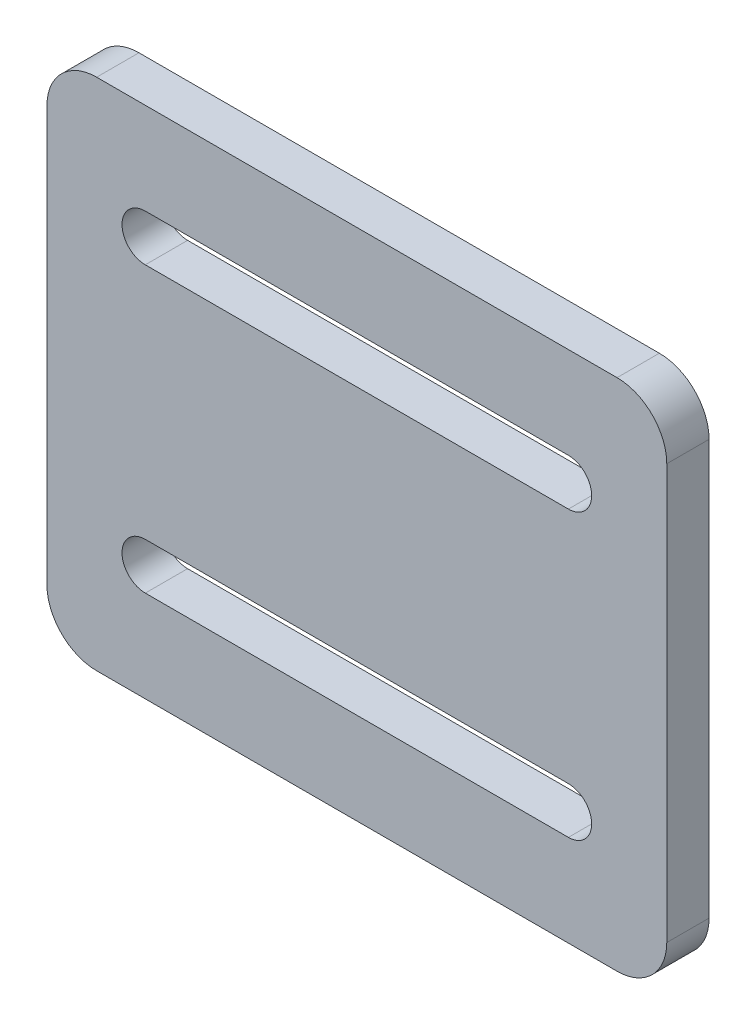
ISO-10303-21;
HEADER;
FILE_DESCRIPTION(('STEP AP214'),'2;1');
FILE_NAME('part.step','',(''),(''),'','','');
FILE_SCHEMA(('AUTOMOTIVE_DESIGN { 1 0 10303 214 1 1 1 1 }'));
ENDSEC;
DATA;
#1=APPLICATION_CONTEXT('core data for automotive mechanical design processes');
#2=APPLICATION_PROTOCOL_DEFINITION('international standard','automotive_design',2000,#1);
#3=PRODUCT_CONTEXT('',#1,'mechanical');
#4=PRODUCT('Part','Part','',(#3));
#5=PRODUCT_RELATED_PRODUCT_CATEGORY('part','',(#4));
#6=PRODUCT_DEFINITION_FORMATION('','',#4);
#7=PRODUCT_DEFINITION_CONTEXT('part definition',#1,'design');
#8=PRODUCT_DEFINITION('design','',#6,#7);
#9=PRODUCT_DEFINITION_SHAPE('','',#8);
#10=(LENGTH_UNIT() NAMED_UNIT(*) SI_UNIT(.MILLI.,.METRE.));
#11=(NAMED_UNIT(*) PLANE_ANGLE_UNIT() SI_UNIT($,.RADIAN.));
#12=(NAMED_UNIT(*) SI_UNIT($,.STERADIAN.) SOLID_ANGLE_UNIT());
#13=UNCERTAINTY_MEASURE_WITH_UNIT(LENGTH_MEASURE(1.E-05),#10,'distance_accuracy_value','');
#14=(GEOMETRIC_REPRESENTATION_CONTEXT(3) GLOBAL_UNCERTAINTY_ASSIGNED_CONTEXT((#13)) GLOBAL_UNIT_ASSIGNED_CONTEXT((#10,
#11,#12)) REPRESENTATION_CONTEXT('',''));
#15=CARTESIAN_POINT('',(0.,0.,0.));
#16=DIRECTION('',(0.,0.,1.));
#17=DIRECTION('',(1.,0.,0.));
#18=AXIS2_PLACEMENT_3D('',#15,#16,#17);
#19=CARTESIAN_POINT('',(-36.854396855232,20.8824296097592,2.));
#20=DIRECTION('',(0.,0.,1.));
#21=DIRECTION('',(1.,0.,0.));
#22=AXIS2_PLACEMENT_3D('',#19,#20,#21);
#23=PLANE('',#22);
#24=DIRECTION('',(1.,0.,0.));
#25=VECTOR('',#24,1.);
#26=CARTESIAN_POINT('',(-34.554396855232,16.7024296097592,2.));
#27=LINE('',#26,#25);
#28=CARTESIAN_POINT('',(-34.554396855232,16.7024296097592,2.));
#29=VERTEX_POINT('',#28);
#30=CARTESIAN_POINT('',(-14.554396855232,16.7024296097592,2.));
#31=VERTEX_POINT('',#30);
#32=EDGE_CURVE('E216',#29,#31,#27,.T.);
#33=ORIENTED_EDGE('',*,*,#32,.F.);
#34=CARTESIAN_POINT('',(-34.554396855232,17.8024296097592,2.));
#35=DIRECTION('',(0.,0.,1.));
#36=DIRECTION('',(1.,0.,0.));
#37=AXIS2_PLACEMENT_3D('',#34,#35,#36);
#38=CIRCLE('',#37,1.1);
#39=CARTESIAN_POINT('',(-34.5543968552321,18.9024296097592,2.));
#40=VERTEX_POINT('',#39);
#41=EDGE_CURVE('E214',#40,#29,#38,.T.);
#42=ORIENTED_EDGE('',*,*,#41,.F.);
#43=DIRECTION('',(-1.,0.,0.));
#44=VECTOR('',#43,1.);
#45=CARTESIAN_POINT('',(-14.554396855232,18.9024296097592,2.));
#46=LINE('',#45,#44);
#47=CARTESIAN_POINT('',(-14.554396855232,18.9024296097592,2.));
#48=VERTEX_POINT('',#47);
#49=EDGE_CURVE('E222',#48,#40,#46,.T.);
#50=ORIENTED_EDGE('',*,*,#49,.F.);
#51=CARTESIAN_POINT('',(-14.554396855232,17.8024296097592,2.));
#52=DIRECTION('',(0.,0.,1.));
#53=DIRECTION('',(1.,0.,0.));
#54=AXIS2_PLACEMENT_3D('',#51,#52,#53);
#55=CIRCLE('',#54,1.1);
#56=EDGE_CURVE('E219',#31,#48,#55,.T.);
#57=ORIENTED_EDGE('',*,*,#56,.F.);
#58=EDGE_LOOP('',(#33,#42,#50,#57));
#59=FACE_BOUND('',#58,.T.);
#60=DIRECTION('',(1.,0.,0.));
#61=VECTOR('',#60,1.);
#62=CARTESIAN_POINT('',(-34.554396855232,3.26242960975919,2.));
#63=LINE('',#62,#61);
#64=CARTESIAN_POINT('',(-34.554396855232,3.26242960975919,2.));
#65=VERTEX_POINT('',#64);
#66=CARTESIAN_POINT('',(-14.554396855232,3.26242960975919,2.));
#67=VERTEX_POINT('',#66);
#68=EDGE_CURVE('E247',#65,#67,#63,.T.);
#69=ORIENTED_EDGE('',*,*,#68,.F.);
#70=CARTESIAN_POINT('',(-34.554396855232,4.36242960975919,2.));
#71=DIRECTION('',(0.,0.,1.));
#72=DIRECTION('',(1.,0.,0.));
#73=AXIS2_PLACEMENT_3D('',#70,#71,#72);
#74=CIRCLE('',#73,1.1);
#75=CARTESIAN_POINT('',(-34.554396855232,5.46242960975919,2.));
#76=VERTEX_POINT('',#75);
#77=EDGE_CURVE('E245',#76,#65,#74,.T.);
#78=ORIENTED_EDGE('',*,*,#77,.F.);
#79=DIRECTION('',(-1.,0.,0.));
#80=VECTOR('',#79,1.);
#81=CARTESIAN_POINT('',(-14.554396855232,5.46242960975919,2.));
#82=LINE('',#81,#80);
#83=CARTESIAN_POINT('',(-14.554396855232,5.46242960975919,2.));
#84=VERTEX_POINT('',#83);
#85=EDGE_CURVE('E253',#84,#76,#82,.T.);
#86=ORIENTED_EDGE('',*,*,#85,.F.);
#87=CARTESIAN_POINT('',(-14.554396855232,4.36242960975919,2.));
#88=DIRECTION('',(0.,0.,1.));
#89=DIRECTION('',(1.,0.,0.));
#90=AXIS2_PLACEMENT_3D('',#87,#88,#89);
#91=CIRCLE('',#90,1.1);
#92=EDGE_CURVE('E250',#67,#84,#91,.T.);
#93=ORIENTED_EDGE('',*,*,#92,.F.);
#94=EDGE_LOOP('',(#69,#78,#86,#93));
#95=FACE_BOUND('',#94,.T.);
#96=DIRECTION('',(-1.,0.,0.));
#97=VECTOR('',#96,1.);
#98=CARTESIAN_POINT('',(-12.254396855232,23.2324296097592,2.));
#99=LINE('',#98,#97);
#100=CARTESIAN_POINT('',(-12.254396855232,23.2324296097592,2.));
#101=VERTEX_POINT('',#100);
#102=CARTESIAN_POINT('',(-36.854396855232,23.2324296097592,2.));
#103=VERTEX_POINT('',#102);
#104=EDGE_CURVE('E199',#101,#103,#99,.T.);
#105=ORIENTED_EDGE('',*,*,#104,.T.);
#106=CARTESIAN_POINT('',(-36.854396855232,20.8824296097592,2.));
#107=DIRECTION('',(0.,0.,1.));
#108=DIRECTION('',(1.,0.,0.));
#109=AXIS2_PLACEMENT_3D('',#106,#107,#108);
#110=CIRCLE('',#109,2.35);
#111=CARTESIAN_POINT('',(-39.204396855232,20.8824296097592,2.));
#112=VERTEX_POINT('',#111);
#113=EDGE_CURVE('E182',#103,#112,#110,.T.);
#114=ORIENTED_EDGE('',*,*,#113,.T.);
#115=DIRECTION('',(0.,-1.,0.));
#116=VECTOR('',#115,1.);
#117=CARTESIAN_POINT('',(-39.204396855232,20.8824296097592,2.));
#118=LINE('',#117,#116);
#119=CARTESIAN_POINT('',(-39.204396855232,1.28242960975919,2.));
#120=VERTEX_POINT('',#119);
#121=EDGE_CURVE('E185',#112,#120,#118,.T.);
#122=ORIENTED_EDGE('',*,*,#121,.T.);
#123=CARTESIAN_POINT('',(-36.854396855232,1.28242960975919,2.));
#124=DIRECTION('',(0.,0.,1.));
#125=DIRECTION('',(1.,0.,0.));
#126=AXIS2_PLACEMENT_3D('',#123,#124,#125);
#127=CIRCLE('',#126,2.35000000000001);
#128=CARTESIAN_POINT('',(-36.854396855232,-1.06757039024081,2.));
#129=VERTEX_POINT('',#128);
#130=EDGE_CURVE('E48',#120,#129,#127,.T.);
#131=ORIENTED_EDGE('',*,*,#130,.T.);
#132=DIRECTION('',(1.,0.,0.));
#133=VECTOR('',#132,1.);
#134=CARTESIAN_POINT('',(-36.854396855232,-1.06757039024081,2.));
#135=LINE('',#134,#133);
#136=CARTESIAN_POINT('',(-12.254396855232,-1.06757039024081,2.));
#137=VERTEX_POINT('',#136);
#138=EDGE_CURVE('E153',#129,#137,#135,.T.);
#139=ORIENTED_EDGE('',*,*,#138,.T.);
#140=CARTESIAN_POINT('',(-12.254396855232,1.28242960975919,2.));
#141=DIRECTION('',(0.,0.,1.));
#142=DIRECTION('',(1.,0.,0.));
#143=AXIS2_PLACEMENT_3D('',#140,#141,#142);
#144=CIRCLE('',#143,2.35);
#145=CARTESIAN_POINT('',(-9.90439685523203,1.28242960975919,2.));
#146=VERTEX_POINT('',#145);
#147=EDGE_CURVE('E190',#137,#146,#144,.T.);
#148=ORIENTED_EDGE('',*,*,#147,.T.);
#149=DIRECTION('',(0.,1.,0.));
#150=VECTOR('',#149,1.);
#151=CARTESIAN_POINT('',(-9.90439685523203,1.28242960975919,2.));
#152=LINE('',#151,#150);
#153=CARTESIAN_POINT('',(-9.90439685523203,20.8824296097592,2.));
#154=VERTEX_POINT('',#153);
#155=EDGE_CURVE('E193',#146,#154,#152,.T.);
#156=ORIENTED_EDGE('',*,*,#155,.T.);
#157=CARTESIAN_POINT('',(-12.254396855232,20.8824296097592,2.));
#158=DIRECTION('',(0.,0.,1.));
#159=DIRECTION('',(1.,0.,0.));
#160=AXIS2_PLACEMENT_3D('',#157,#158,#159);
#161=CIRCLE('',#160,2.35);
#162=EDGE_CURVE('E196',#154,#101,#161,.T.);
#163=ORIENTED_EDGE('',*,*,#162,.T.);
#164=EDGE_LOOP('',(#105,#114,#122,#131,#139,#148,#156,#163));
#165=FACE_BOUND('',#164,.T.);
#166=ADVANCED_FACE('F33',(#59,#95,#165),#23,.T.);
#167=CARTESIAN_POINT('',(-36.854396855232,20.8824296097592,0.));
#168=DIRECTION('',(0.,0.,1.));
#169=DIRECTION('',(1.,0.,0.));
#170=AXIS2_PLACEMENT_3D('',#167,#168,#169);
#171=PLANE('',#170);
#172=CARTESIAN_POINT('',(-34.554396855232,17.8024296097592,0.));
#173=DIRECTION('',(0.,0.,1.));
#174=DIRECTION('',(1.,0.,0.));
#175=AXIS2_PLACEMENT_3D('',#172,#173,#174);
#176=CIRCLE('',#175,1.1);
#177=CARTESIAN_POINT('',(-34.5543968552321,18.9024296097592,0.));
#178=VERTEX_POINT('',#177);
#179=CARTESIAN_POINT('',(-34.554396855232,16.7024296097592,0.));
#180=VERTEX_POINT('',#179);
#181=EDGE_CURVE('E204',#178,#180,#176,.T.);
#182=ORIENTED_EDGE('',*,*,#181,.T.);
#183=DIRECTION('',(1.,0.,0.));
#184=VECTOR('',#183,1.);
#185=CARTESIAN_POINT('',(-34.554396855232,16.7024296097592,0.));
#186=LINE('',#185,#184);
#187=CARTESIAN_POINT('',(-14.554396855232,16.7024296097592,0.));
#188=VERTEX_POINT('',#187);
#189=EDGE_CURVE('E227',#180,#188,#186,.T.);
#190=ORIENTED_EDGE('',*,*,#189,.T.);
#191=CARTESIAN_POINT('',(-14.554396855232,17.8024296097592,0.));
#192=DIRECTION('',(0.,0.,1.));
#193=DIRECTION('',(1.,0.,0.));
#194=AXIS2_PLACEMENT_3D('',#191,#192,#193);
#195=CIRCLE('',#194,1.1);
#196=CARTESIAN_POINT('',(-14.554396855232,18.9024296097592,0.));
#197=VERTEX_POINT('',#196);
#198=EDGE_CURVE('E230',#188,#197,#195,.T.);
#199=ORIENTED_EDGE('',*,*,#198,.T.);
#200=DIRECTION('',(-1.,0.,0.));
#201=VECTOR('',#200,1.);
#202=CARTESIAN_POINT('',(-14.554396855232,18.9024296097592,0.));
#203=LINE('',#202,#201);
#204=EDGE_CURVE('E217',#197,#178,#203,.T.);
#205=ORIENTED_EDGE('',*,*,#204,.T.);
#206=EDGE_LOOP('',(#182,#190,#199,#205));
#207=FACE_BOUND('',#206,.T.);
#208=CARTESIAN_POINT('',(-34.554396855232,4.36242960975919,0.));
#209=DIRECTION('',(0.,0.,1.));
#210=DIRECTION('',(1.,0.,0.));
#211=AXIS2_PLACEMENT_3D('',#208,#209,#210);
#212=CIRCLE('',#211,1.1);
#213=CARTESIAN_POINT('',(-34.554396855232,5.46242960975919,0.));
#214=VERTEX_POINT('',#213);
#215=CARTESIAN_POINT('',(-34.554396855232,3.26242960975919,0.));
#216=VERTEX_POINT('',#215);
#217=EDGE_CURVE('E244',#214,#216,#212,.T.);
#218=ORIENTED_EDGE('',*,*,#217,.T.);
#219=DIRECTION('',(1.,0.,0.));
#220=VECTOR('',#219,1.);
#221=CARTESIAN_POINT('',(-34.554396855232,3.26242960975919,0.));
#222=LINE('',#221,#220);
#223=CARTESIAN_POINT('',(-14.554396855232,3.26242960975919,0.));
#224=VERTEX_POINT('',#223);
#225=EDGE_CURVE('E258',#216,#224,#222,.T.);
#226=ORIENTED_EDGE('',*,*,#225,.T.);
#227=CARTESIAN_POINT('',(-14.554396855232,4.36242960975919,0.));
#228=DIRECTION('',(0.,0.,1.));
#229=DIRECTION('',(1.,0.,0.));
#230=AXIS2_PLACEMENT_3D('',#227,#228,#229);
#231=CIRCLE('',#230,1.1);
#232=CARTESIAN_POINT('',(-14.554396855232,5.46242960975919,0.));
#233=VERTEX_POINT('',#232);
#234=EDGE_CURVE('E261',#224,#233,#231,.T.);
#235=ORIENTED_EDGE('',*,*,#234,.T.);
#236=DIRECTION('',(-1.,0.,0.));
#237=VECTOR('',#236,1.);
#238=CARTESIAN_POINT('',(-14.554396855232,5.46242960975919,0.));
#239=LINE('',#238,#237);
#240=EDGE_CURVE('E248',#233,#214,#239,.T.);
#241=ORIENTED_EDGE('',*,*,#240,.T.);
#242=EDGE_LOOP('',(#218,#226,#235,#241));
#243=FACE_BOUND('',#242,.T.);
#244=CARTESIAN_POINT('',(-36.854396855232,20.8824296097592,0.));
#245=DIRECTION('',(0.,0.,1.));
#246=DIRECTION('',(1.,0.,0.));
#247=AXIS2_PLACEMENT_3D('',#244,#245,#246);
#248=CIRCLE('',#247,2.35);
#249=CARTESIAN_POINT('',(-36.854396855232,23.2324296097592,0.));
#250=VERTEX_POINT('',#249);
#251=CARTESIAN_POINT('',(-39.204396855232,20.8824296097592,0.));
#252=VERTEX_POINT('',#251);
#253=EDGE_CURVE('E56',#250,#252,#248,.T.);
#254=ORIENTED_EDGE('',*,*,#253,.F.);
#255=DIRECTION('',(-1.,0.,0.));
#256=VECTOR('',#255,1.);
#257=CARTESIAN_POINT('',(-12.254396855232,23.2324296097592,0.));
#258=LINE('',#257,#256);
#259=CARTESIAN_POINT('',(-12.254396855232,23.2324296097592,0.));
#260=VERTEX_POINT('',#259);
#261=EDGE_CURVE('E178',#260,#250,#258,.T.);
#262=ORIENTED_EDGE('',*,*,#261,.F.);
#263=CARTESIAN_POINT('',(-12.254396855232,20.8824296097592,0.));
#264=DIRECTION('',(0.,0.,1.));
#265=DIRECTION('',(1.,0.,0.));
#266=AXIS2_PLACEMENT_3D('',#263,#264,#265);
#267=CIRCLE('',#266,2.35);
#268=CARTESIAN_POINT('',(-9.90439685523203,20.8824296097592,0.));
#269=VERTEX_POINT('',#268);
#270=EDGE_CURVE('E175',#269,#260,#267,.T.);
#271=ORIENTED_EDGE('',*,*,#270,.F.);
#272=DIRECTION('',(0.,1.,0.));
#273=VECTOR('',#272,1.);
#274=CARTESIAN_POINT('',(-9.90439685523203,1.28242960975919,0.));
#275=LINE('',#274,#273);
#276=CARTESIAN_POINT('',(-9.90439685523203,1.28242960975919,0.));
#277=VERTEX_POINT('',#276);
#278=EDGE_CURVE('E169',#277,#269,#275,.T.);
#279=ORIENTED_EDGE('',*,*,#278,.F.);
#280=CARTESIAN_POINT('',(-12.254396855232,1.28242960975919,0.));
#281=DIRECTION('',(0.,0.,1.));
#282=DIRECTION('',(1.,0.,0.));
#283=AXIS2_PLACEMENT_3D('',#280,#281,#282);
#284=CIRCLE('',#283,2.35);
#285=CARTESIAN_POINT('',(-12.254396855232,-1.06757039024081,0.));
#286=VERTEX_POINT('',#285);
#287=EDGE_CURVE('E167',#286,#277,#284,.T.);
#288=ORIENTED_EDGE('',*,*,#287,.F.);
#289=DIRECTION('',(1.,0.,0.));
#290=VECTOR('',#289,1.);
#291=CARTESIAN_POINT('',(-36.854396855232,-1.06757039024081,0.));
#292=LINE('',#291,#290);
#293=CARTESIAN_POINT('',(-36.854396855232,-1.06757039024081,0.));
#294=VERTEX_POINT('',#293);
#295=EDGE_CURVE('E150',#294,#286,#292,.T.);
#296=ORIENTED_EDGE('',*,*,#295,.F.);
#297=CARTESIAN_POINT('',(-36.854396855232,1.28242960975919,0.));
#298=DIRECTION('',(0.,0.,1.));
#299=DIRECTION('',(1.,0.,0.));
#300=AXIS2_PLACEMENT_3D('',#297,#298,#299);
#301=CIRCLE('',#300,2.35000000000001);
#302=CARTESIAN_POINT('',(-39.204396855232,1.28242960975919,0.));
#303=VERTEX_POINT('',#302);
#304=EDGE_CURVE('E158',#303,#294,#301,.T.);
#305=ORIENTED_EDGE('',*,*,#304,.F.);
#306=DIRECTION('',(0.,-1.,0.));
#307=VECTOR('',#306,1.);
#308=CARTESIAN_POINT('',(-39.204396855232,20.8824296097592,0.));
#309=LINE('',#308,#307);
#310=EDGE_CURVE('E163',#252,#303,#309,.T.);
#311=ORIENTED_EDGE('',*,*,#310,.F.);
#312=EDGE_LOOP('',(#254,#262,#271,#279,#288,#296,#305,#311));
#313=FACE_BOUND('',#312,.T.);
#314=ADVANCED_FACE('F35',(#207,#243,#313),#171,.F.);
#315=CARTESIAN_POINT('',(-34.554396855232,4.36242960975919,2.));
#316=DIRECTION('',(0.,0.,-1.));
#317=DIRECTION('',(-1.,0.,0.));
#318=AXIS2_PLACEMENT_3D('',#315,#316,#317);
#319=CYLINDRICAL_SURFACE('',#318,1.1);
#320=ORIENTED_EDGE('',*,*,#217,.F.);
#321=DIRECTION('',(0.,0.,-1.));
#322=VECTOR('',#321,1.);
#323=CARTESIAN_POINT('',(-34.554396855232,5.46242960975919,2.));
#324=LINE('',#323,#322);
#325=EDGE_CURVE('E255',#76,#214,#324,.T.);
#326=ORIENTED_EDGE('',*,*,#325,.F.);
#327=ORIENTED_EDGE('',*,*,#77,.T.);
#328=DIRECTION('',(0.,0.,-1.));
#329=VECTOR('',#328,1.);
#330=CARTESIAN_POINT('',(-34.554396855232,3.26242960975919,2.));
#331=LINE('',#330,#329);
#332=EDGE_CURVE('E11',#65,#216,#331,.T.);
#333=ORIENTED_EDGE('',*,*,#332,.T.);
#334=EDGE_LOOP('',(#320,#326,#327,#333));
#335=FACE_BOUND('',#334,.T.);
#336=ADVANCED_FACE('F282',(#335),#319,.F.);
#337=CARTESIAN_POINT('',(-34.554396855232,3.26242960975919,2.));
#338=DIRECTION('',(0.,1.,0.));
#339=DIRECTION('',(-1.,0.,0.));
#340=AXIS2_PLACEMENT_3D('',#337,#338,#339);
#341=PLANE('',#340);
#342=ORIENTED_EDGE('',*,*,#225,.F.);
#343=ORIENTED_EDGE('',*,*,#332,.F.);
#344=ORIENTED_EDGE('',*,*,#68,.T.);
#345=DIRECTION('',(0.,0.,-1.));
#346=VECTOR('',#345,1.);
#347=CARTESIAN_POINT('',(-14.554396855232,3.26242960975919,2.));
#348=LINE('',#347,#346);
#349=EDGE_CURVE('E41',#67,#224,#348,.T.);
#350=ORIENTED_EDGE('',*,*,#349,.T.);
#351=EDGE_LOOP('',(#342,#343,#344,#350));
#352=FACE_BOUND('',#351,.T.);
#353=ADVANCED_FACE('F272',(#352),#341,.T.);
#354=CARTESIAN_POINT('',(-14.554396855232,4.36242960975919,2.));
#355=DIRECTION('',(0.,0.,-1.));
#356=DIRECTION('',(-1.,0.,0.));
#357=AXIS2_PLACEMENT_3D('',#354,#355,#356);
#358=CYLINDRICAL_SURFACE('',#357,1.1);
#359=ORIENTED_EDGE('',*,*,#234,.F.);
#360=ORIENTED_EDGE('',*,*,#349,.F.);
#361=ORIENTED_EDGE('',*,*,#92,.T.);
#362=DIRECTION('',(0.,0.,-1.));
#363=VECTOR('',#362,1.);
#364=CARTESIAN_POINT('',(-14.554396855232,5.46242960975919,2.));
#365=LINE('',#364,#363);
#366=EDGE_CURVE('E268',#84,#233,#365,.T.);
#367=ORIENTED_EDGE('',*,*,#366,.T.);
#368=EDGE_LOOP('',(#359,#360,#361,#367));
#369=FACE_BOUND('',#368,.T.);
#370=ADVANCED_FACE('F277',(#369),#358,.F.);
#371=CARTESIAN_POINT('',(-14.554396855232,5.46242960975919,2.));
#372=DIRECTION('',(0.,-1.,0.));
#373=DIRECTION('',(1.,0.,0.));
#374=AXIS2_PLACEMENT_3D('',#371,#372,#373);
#375=PLANE('',#374);
#376=ORIENTED_EDGE('',*,*,#240,.F.);
#377=ORIENTED_EDGE('',*,*,#366,.F.);
#378=ORIENTED_EDGE('',*,*,#85,.T.);
#379=ORIENTED_EDGE('',*,*,#325,.T.);
#380=EDGE_LOOP('',(#376,#377,#378,#379));
#381=FACE_BOUND('',#380,.T.);
#382=ADVANCED_FACE('F285',(#381),#375,.T.);
#383=CARTESIAN_POINT('',(-34.554396855232,17.8024296097592,2.));
#384=DIRECTION('',(0.,0.,-1.));
#385=DIRECTION('',(-1.,0.,0.));
#386=AXIS2_PLACEMENT_3D('',#383,#384,#385);
#387=CYLINDRICAL_SURFACE('',#386,1.1);
#388=ORIENTED_EDGE('',*,*,#181,.F.);
#389=DIRECTION('',(0.,0.,-1.));
#390=VECTOR('',#389,1.);
#391=CARTESIAN_POINT('',(-34.5543968552321,18.9024296097592,2.));
#392=LINE('',#391,#390);
#393=EDGE_CURVE('E224',#40,#178,#392,.T.);
#394=ORIENTED_EDGE('',*,*,#393,.F.);
#395=ORIENTED_EDGE('',*,*,#41,.T.);
#396=DIRECTION('',(0.,0.,-1.));
#397=VECTOR('',#396,1.);
#398=CARTESIAN_POINT('',(-34.554396855232,16.7024296097592,2.));
#399=LINE('',#398,#397);
#400=EDGE_CURVE('E241',#29,#180,#399,.T.);
#401=ORIENTED_EDGE('',*,*,#400,.T.);
#402=EDGE_LOOP('',(#388,#394,#395,#401));
#403=FACE_BOUND('',#402,.T.);
#404=ADVANCED_FACE('F341',(#403),#387,.F.);
#405=CARTESIAN_POINT('',(-34.554396855232,16.7024296097592,2.));
#406=DIRECTION('',(0.,1.,0.));
#407=DIRECTION('',(0.,0.,1.));
#408=AXIS2_PLACEMENT_3D('',#405,#406,#407);
#409=PLANE('',#408);
#410=ORIENTED_EDGE('',*,*,#189,.F.);
#411=ORIENTED_EDGE('',*,*,#400,.F.);
#412=ORIENTED_EDGE('',*,*,#32,.T.);
#413=DIRECTION('',(0.,0.,-1.));
#414=VECTOR('',#413,1.);
#415=CARTESIAN_POINT('',(-14.554396855232,16.7024296097592,2.));
#416=LINE('',#415,#414);
#417=EDGE_CURVE('E239',#31,#188,#416,.T.);
#418=ORIENTED_EDGE('',*,*,#417,.T.);
#419=EDGE_LOOP('',(#410,#411,#412,#418));
#420=FACE_BOUND('',#419,.T.);
#421=ADVANCED_FACE('F337',(#420),#409,.T.);
#422=CARTESIAN_POINT('',(-14.554396855232,17.8024296097592,2.));
#423=DIRECTION('',(0.,0.,-1.));
#424=DIRECTION('',(-1.,0.,0.));
#425=AXIS2_PLACEMENT_3D('',#422,#423,#424);
#426=CYLINDRICAL_SURFACE('',#425,1.1);
#427=ORIENTED_EDGE('',*,*,#198,.F.);
#428=ORIENTED_EDGE('',*,*,#417,.F.);
#429=ORIENTED_EDGE('',*,*,#56,.T.);
#430=DIRECTION('',(0.,0.,-1.));
#431=VECTOR('',#430,1.);
#432=CARTESIAN_POINT('',(-14.554396855232,18.9024296097592,2.));
#433=LINE('',#432,#431);
#434=EDGE_CURVE('E237',#48,#197,#433,.T.);
#435=ORIENTED_EDGE('',*,*,#434,.T.);
#436=EDGE_LOOP('',(#427,#428,#429,#435));
#437=FACE_BOUND('',#436,.T.);
#438=ADVANCED_FACE('F333',(#437),#426,.F.);
#439=CARTESIAN_POINT('',(-14.554396855232,18.9024296097592,2.));
#440=DIRECTION('',(0.,-1.,0.));
#441=DIRECTION('',(1.,0.,0.));
#442=AXIS2_PLACEMENT_3D('',#439,#440,#441);
#443=PLANE('',#442);
#444=ORIENTED_EDGE('',*,*,#204,.F.);
#445=ORIENTED_EDGE('',*,*,#434,.F.);
#446=ORIENTED_EDGE('',*,*,#49,.T.);
#447=ORIENTED_EDGE('',*,*,#393,.T.);
#448=EDGE_LOOP('',(#444,#445,#446,#447));
#449=FACE_BOUND('',#448,.T.);
#450=ADVANCED_FACE('F330',(#449),#443,.T.);
#451=CARTESIAN_POINT('',(-36.854396855232,20.8824296097592,0.));
#452=DIRECTION('',(0.,0.,1.));
#453=DIRECTION('',(1.,0.,0.));
#454=AXIS2_PLACEMENT_3D('',#451,#452,#453);
#455=CYLINDRICAL_SURFACE('',#454,2.35);
#456=ORIENTED_EDGE('',*,*,#113,.F.);
#457=DIRECTION('',(0.,0.,1.));
#458=VECTOR('',#457,1.);
#459=CARTESIAN_POINT('',(-36.854396855232,23.2324296097592,0.));
#460=LINE('',#459,#458);
#461=EDGE_CURVE('E202',#250,#103,#460,.T.);
#462=ORIENTED_EDGE('',*,*,#461,.F.);
#463=ORIENTED_EDGE('',*,*,#253,.T.);
#464=DIRECTION('',(0.,0.,1.));
#465=VECTOR('',#464,1.);
#466=CARTESIAN_POINT('',(-39.204396855232,20.8824296097592,0.));
#467=LINE('',#466,#465);
#468=EDGE_CURVE('E181',#252,#112,#467,.T.);
#469=ORIENTED_EDGE('',*,*,#468,.T.);
#470=EDGE_LOOP('',(#456,#462,#463,#469));
#471=FACE_BOUND('',#470,.T.);
#472=ADVANCED_FACE('F297',(#471),#455,.T.);
#473=CARTESIAN_POINT('',(-12.254396855232,23.2324296097592,0.));
#474=DIRECTION('',(0.,1.,0.));
#475=DIRECTION('',(-1.,0.,0.));
#476=AXIS2_PLACEMENT_3D('',#473,#474,#475);
#477=PLANE('',#476);
#478=ORIENTED_EDGE('',*,*,#104,.F.);
#479=DIRECTION('',(0.,0.,1.));
#480=VECTOR('',#479,1.);
#481=CARTESIAN_POINT('',(-12.254396855232,23.2324296097592,0.));
#482=LINE('',#481,#480);
#483=EDGE_CURVE('E205',#260,#101,#482,.T.);
#484=ORIENTED_EDGE('',*,*,#483,.F.);
#485=ORIENTED_EDGE('',*,*,#261,.T.);
#486=ORIENTED_EDGE('',*,*,#461,.T.);
#487=EDGE_LOOP('',(#478,#484,#485,#486));
#488=FACE_BOUND('',#487,.T.);
#489=ADVANCED_FACE('F295',(#488),#477,.T.);
#490=CARTESIAN_POINT('',(-12.254396855232,20.8824296097592,0.));
#491=DIRECTION('',(0.,0.,1.));
#492=DIRECTION('',(1.,0.,0.));
#493=AXIS2_PLACEMENT_3D('',#490,#491,#492);
#494=CYLINDRICAL_SURFACE('',#493,2.35);
#495=ORIENTED_EDGE('',*,*,#162,.F.);
#496=DIRECTION('',(0.,0.,1.));
#497=VECTOR('',#496,1.);
#498=CARTESIAN_POINT('',(-9.90439685523203,20.8824296097592,0.));
#499=LINE('',#498,#497);
#500=EDGE_CURVE('E207',#269,#154,#499,.T.);
#501=ORIENTED_EDGE('',*,*,#500,.F.);
#502=ORIENTED_EDGE('',*,*,#270,.T.);
#503=ORIENTED_EDGE('',*,*,#483,.T.);
#504=EDGE_LOOP('',(#495,#501,#502,#503));
#505=FACE_BOUND('',#504,.T.);
#506=ADVANCED_FACE('F309',(#505),#494,.T.);
#507=CARTESIAN_POINT('',(-9.90439685523203,1.28242960975919,0.));
#508=DIRECTION('',(1.,0.,0.));
#509=DIRECTION('',(0.,1.,0.));
#510=AXIS2_PLACEMENT_3D('',#507,#508,#509);
#511=PLANE('',#510);
#512=ORIENTED_EDGE('',*,*,#155,.F.);
#513=DIRECTION('',(0.,0.,1.));
#514=VECTOR('',#513,1.);
#515=CARTESIAN_POINT('',(-9.90439685523203,1.28242960975919,0.));
#516=LINE('',#515,#514);
#517=EDGE_CURVE('E209',#277,#146,#516,.T.);
#518=ORIENTED_EDGE('',*,*,#517,.F.);
#519=ORIENTED_EDGE('',*,*,#278,.T.);
#520=ORIENTED_EDGE('',*,*,#500,.T.);
#521=EDGE_LOOP('',(#512,#518,#519,#520));
#522=FACE_BOUND('',#521,.T.);
#523=ADVANCED_FACE('F306',(#522),#511,.T.);
#524=CARTESIAN_POINT('',(-12.254396855232,1.28242960975919,0.));
#525=DIRECTION('',(0.,0.,1.));
#526=DIRECTION('',(1.,0.,0.));
#527=AXIS2_PLACEMENT_3D('',#524,#525,#526);
#528=CYLINDRICAL_SURFACE('',#527,2.35);
#529=ORIENTED_EDGE('',*,*,#147,.F.);
#530=DIRECTION('',(0.,0.,1.));
#531=VECTOR('',#530,1.);
#532=CARTESIAN_POINT('',(-12.254396855232,-1.06757039024081,0.));
#533=LINE('',#532,#531);
#534=EDGE_CURVE('E154',#286,#137,#533,.T.);
#535=ORIENTED_EDGE('',*,*,#534,.F.);
#536=ORIENTED_EDGE('',*,*,#287,.T.);
#537=ORIENTED_EDGE('',*,*,#517,.T.);
#538=EDGE_LOOP('',(#529,#535,#536,#537));
#539=FACE_BOUND('',#538,.T.);
#540=ADVANCED_FACE('F304',(#539),#528,.T.);
#541=CARTESIAN_POINT('',(-36.854396855232,-1.06757039024081,0.));
#542=DIRECTION('',(0.,-1.,0.));
#543=DIRECTION('',(1.,0.,0.));
#544=AXIS2_PLACEMENT_3D('',#541,#542,#543);
#545=PLANE('',#544);
#546=ORIENTED_EDGE('',*,*,#138,.F.);
#547=DIRECTION('',(0.,0.,1.));
#548=VECTOR('',#547,1.);
#549=CARTESIAN_POINT('',(-36.854396855232,-1.06757039024081,0.));
#550=LINE('',#549,#548);
#551=EDGE_CURVE('E146',#294,#129,#550,.T.);
#552=ORIENTED_EDGE('',*,*,#551,.F.);
#553=ORIENTED_EDGE('',*,*,#295,.T.);
#554=ORIENTED_EDGE('',*,*,#534,.T.);
#555=EDGE_LOOP('',(#546,#552,#553,#554));
#556=FACE_BOUND('',#555,.T.);
#557=ADVANCED_FACE('F148',(#556),#545,.T.);
#558=CARTESIAN_POINT('',(-36.854396855232,1.28242960975919,0.));
#559=DIRECTION('',(0.,0.,1.));
#560=DIRECTION('',(1.,0.,0.));
#561=AXIS2_PLACEMENT_3D('',#558,#559,#560);
#562=CYLINDRICAL_SURFACE('',#561,2.35000000000001);
#563=ORIENTED_EDGE('',*,*,#130,.F.);
#564=DIRECTION('',(0.,0.,1.));
#565=VECTOR('',#564,1.);
#566=CARTESIAN_POINT('',(-39.204396855232,1.28242960975919,0.));
#567=LINE('',#566,#565);
#568=EDGE_CURVE('E155',#303,#120,#567,.T.);
#569=ORIENTED_EDGE('',*,*,#568,.F.);
#570=ORIENTED_EDGE('',*,*,#304,.T.);
#571=ORIENTED_EDGE('',*,*,#551,.T.);
#572=EDGE_LOOP('',(#563,#569,#570,#571));
#573=FACE_BOUND('',#572,.T.);
#574=ADVANCED_FACE('F159',(#573),#562,.T.);
#575=CARTESIAN_POINT('',(-39.204396855232,20.8824296097592,0.));
#576=DIRECTION('',(-1.,0.,0.));
#577=DIRECTION('',(0.,0.,1.));
#578=AXIS2_PLACEMENT_3D('',#575,#576,#577);
#579=PLANE('',#578);
#580=ORIENTED_EDGE('',*,*,#121,.F.);
#581=ORIENTED_EDGE('',*,*,#468,.F.);
#582=ORIENTED_EDGE('',*,*,#310,.T.);
#583=ORIENTED_EDGE('',*,*,#568,.T.);
#584=EDGE_LOOP('',(#580,#581,#582,#583));
#585=FACE_BOUND('',#584,.T.);
#586=ADVANCED_FACE('F300',(#585),#579,.T.);
#587=CLOSED_SHELL('',(#166,#314,#336,#353,#370,#382,#404,#421,#438,#450,#472,#489,#506,#523,
#540,#557,#574,#586));
#588=MANIFOLD_SOLID_BREP('B2',#587);
#589=ADVANCED_BREP_SHAPE_REPRESENTATION('',(#18,#588),#14);
#590=SHAPE_DEFINITION_REPRESENTATION(#9,#589);
ENDSEC;
END-ISO-10303-21;
